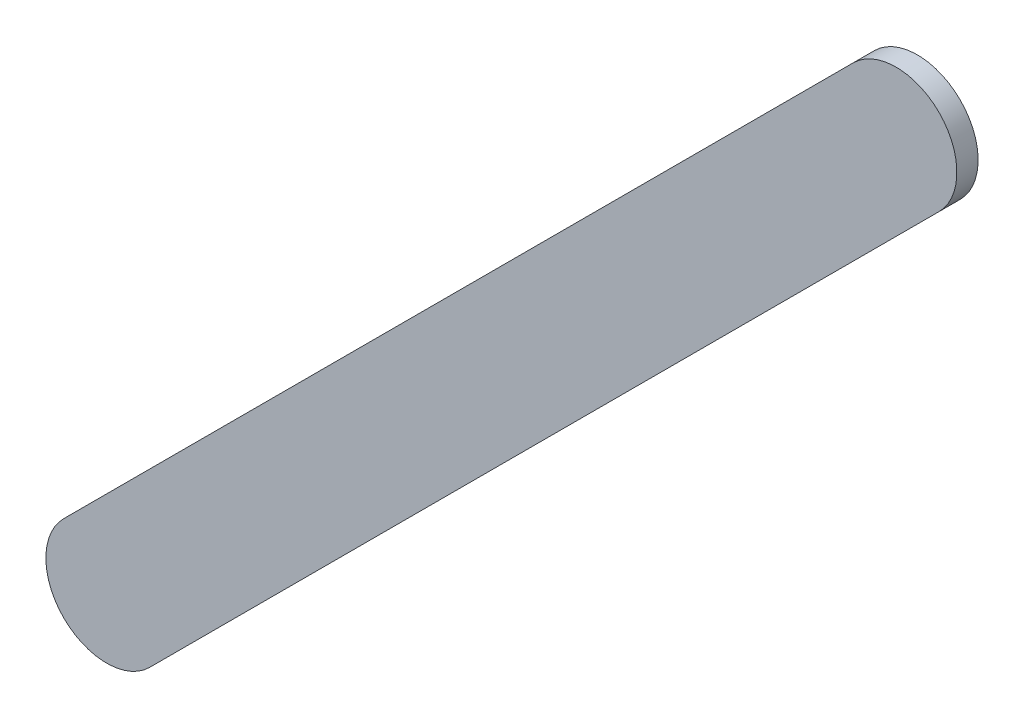
ISO-10303-21;
HEADER;
FILE_DESCRIPTION(('STEP AP214'),'2;1');
FILE_NAME('part.step','',(''),(''),'','','');
FILE_SCHEMA(('AUTOMOTIVE_DESIGN { 1 0 10303 214 1 1 1 1 }'));
ENDSEC;
DATA;
#1=APPLICATION_CONTEXT('core data for automotive mechanical design processes');
#2=APPLICATION_PROTOCOL_DEFINITION('international standard','automotive_design',2000,#1);
#3=PRODUCT_CONTEXT('',#1,'mechanical');
#4=PRODUCT('Part','Part','',(#3));
#5=PRODUCT_RELATED_PRODUCT_CATEGORY('part','',(#4));
#6=PRODUCT_DEFINITION_FORMATION('','',#4);
#7=PRODUCT_DEFINITION_CONTEXT('part definition',#1,'design');
#8=PRODUCT_DEFINITION('design','',#6,#7);
#9=PRODUCT_DEFINITION_SHAPE('','',#8);
#10=(LENGTH_UNIT() NAMED_UNIT(*) SI_UNIT(.MILLI.,.METRE.));
#11=(NAMED_UNIT(*) PLANE_ANGLE_UNIT() SI_UNIT($,.RADIAN.));
#12=(NAMED_UNIT(*) SI_UNIT($,.STERADIAN.) SOLID_ANGLE_UNIT());
#13=UNCERTAINTY_MEASURE_WITH_UNIT(LENGTH_MEASURE(1.E-05),#10,'distance_accuracy_value','');
#14=(GEOMETRIC_REPRESENTATION_CONTEXT(3) GLOBAL_UNCERTAINTY_ASSIGNED_CONTEXT((#13)) GLOBAL_UNIT_ASSIGNED_CONTEXT((#10,
#11,#12)) REPRESENTATION_CONTEXT('',''));
#15=CARTESIAN_POINT('',(0.,0.,0.));
#16=DIRECTION('',(0.,0.,1.));
#17=DIRECTION('',(1.,0.,0.));
#18=AXIS2_PLACEMENT_3D('',#15,#16,#17);
#19=CARTESIAN_POINT('',(82.529289,-117.279289,1.635));
#20=DIRECTION('',(0.,0.,1.));
#21=DIRECTION('',(1.,0.,0.));
#22=AXIS2_PLACEMENT_3D('',#19,#20,#21);
#23=PLANE('',#22);
#24=DIRECTION('',(-0.707106781186548,-0.707106781186548,0.));
#25=VECTOR('',#24,1.);
#26=CARTESIAN_POINT('',(82.529289,-117.279289,1.635));
#27=LINE('',#26,#25);
#28=CARTESIAN_POINT('',(82.529289,-117.279289,1.635));
#29=VERTEX_POINT('',#28);
#30=CARTESIAN_POINT('',(81.229289,-118.579289,1.635));
#31=VERTEX_POINT('',#30);
#32=EDGE_CURVE('E80',#29,#31,#27,.T.);
#33=ORIENTED_EDGE('',*,*,#32,.T.);
#34=CARTESIAN_POINT('',(81.2999995,-118.6499995,1.635));
#35=DIRECTION('',(0.,0.,1.));
#36=DIRECTION('',(-0.707106781186548,0.707106781186548,0.));
#37=AXIS2_PLACEMENT_3D('',#34,#35,#36);
#38=CIRCLE('',#37,0.09999974810218);
#39=CARTESIAN_POINT('',(81.37071,-118.72071,1.635));
#40=VERTEX_POINT('',#39);
#41=EDGE_CURVE('E78',#31,#40,#38,.T.);
#42=ORIENTED_EDGE('',*,*,#41,.T.);
#43=DIRECTION('',(0.707106781186548,0.707106781186548,0.));
#44=VECTOR('',#43,1.);
#45=CARTESIAN_POINT('',(81.37071,-118.72071,1.635));
#46=LINE('',#45,#44);
#47=CARTESIAN_POINT('',(82.67071,-117.42071,1.635));
#48=VERTEX_POINT('',#47);
#49=EDGE_CURVE('E67',#40,#48,#46,.T.);
#50=ORIENTED_EDGE('',*,*,#49,.T.);
#51=CARTESIAN_POINT('',(82.5999995,-117.3499995,1.635));
#52=DIRECTION('',(0.,0.,1.));
#53=DIRECTION('',(0.707106781186548,-0.707106781186548,0.));
#54=AXIS2_PLACEMENT_3D('',#51,#52,#53);
#55=CIRCLE('',#54,0.09999974810218);
#56=EDGE_CURVE('E11',#48,#29,#55,.T.);
#57=ORIENTED_EDGE('',*,*,#56,.T.);
#58=EDGE_LOOP('',(#33,#42,#50,#57));
#59=FACE_BOUND('',#58,.T.);
#60=ADVANCED_FACE('F17',(#59),#23,.T.);
#61=CARTESIAN_POINT('',(82.529289,-117.279289,1.6));
#62=DIRECTION('',(0.,0.,1.));
#63=DIRECTION('',(1.,0.,0.));
#64=AXIS2_PLACEMENT_3D('',#61,#62,#63);
#65=PLANE('',#64);
#66=CARTESIAN_POINT('',(82.5999995,-117.3499995,1.6));
#67=DIRECTION('',(0.,0.,1.));
#68=DIRECTION('',(0.707106781186548,-0.707106781186548,0.));
#69=AXIS2_PLACEMENT_3D('',#66,#67,#68);
#70=CIRCLE('',#69,0.09999974810218);
#71=CARTESIAN_POINT('',(82.67071,-117.42071,1.6));
#72=VERTEX_POINT('',#71);
#73=CARTESIAN_POINT('',(82.529289,-117.279289,1.6));
#74=VERTEX_POINT('',#73);
#75=EDGE_CURVE('E27',#72,#74,#70,.T.);
#76=ORIENTED_EDGE('',*,*,#75,.F.);
#77=DIRECTION('',(0.707106781186548,0.707106781186548,0.));
#78=VECTOR('',#77,1.);
#79=CARTESIAN_POINT('',(81.37071,-118.72071,1.6));
#80=LINE('',#79,#78);
#81=CARTESIAN_POINT('',(81.37071,-118.72071,1.6));
#82=VERTEX_POINT('',#81);
#83=EDGE_CURVE('E85',#82,#72,#80,.T.);
#84=ORIENTED_EDGE('',*,*,#83,.F.);
#85=CARTESIAN_POINT('',(81.2999995,-118.6499995,1.6));
#86=DIRECTION('',(0.,0.,1.));
#87=DIRECTION('',(-0.707106781186548,0.707106781186548,0.));
#88=AXIS2_PLACEMENT_3D('',#85,#86,#87);
#89=CIRCLE('',#88,0.09999974810218);
#90=CARTESIAN_POINT('',(81.229289,-118.579289,1.6));
#91=VERTEX_POINT('',#90);
#92=EDGE_CURVE('E88',#91,#82,#89,.T.);
#93=ORIENTED_EDGE('',*,*,#92,.F.);
#94=DIRECTION('',(-0.707106781186548,-0.707106781186548,0.));
#95=VECTOR('',#94,1.);
#96=CARTESIAN_POINT('',(82.529289,-117.279289,1.6));
#97=LINE('',#96,#95);
#98=EDGE_CURVE('E99',#74,#91,#97,.T.);
#99=ORIENTED_EDGE('',*,*,#98,.F.);
#100=EDGE_LOOP('',(#76,#84,#93,#99));
#101=FACE_BOUND('',#100,.T.);
#102=ADVANCED_FACE('F118',(#101),#65,.F.);
#103=CARTESIAN_POINT('',(82.5999995,-117.3499995,1.6));
#104=DIRECTION('',(0.,0.,-1.));
#105=DIRECTION('',(0.707106781186548,-0.707106781186548,0.));
#106=AXIS2_PLACEMENT_3D('',#103,#104,#105);
#107=CYLINDRICAL_SURFACE('',#106,0.09999974810218);
#108=ORIENTED_EDGE('',*,*,#75,.T.);
#109=DIRECTION('',(0.,0.,1.));
#110=VECTOR('',#109,1.);
#111=CARTESIAN_POINT('',(82.529289,-117.279289,1.6));
#112=LINE('',#111,#110);
#113=EDGE_CURVE('E95',#74,#29,#112,.T.);
#114=ORIENTED_EDGE('',*,*,#113,.T.);
#115=ORIENTED_EDGE('',*,*,#56,.F.);
#116=DIRECTION('',(0.,0.,1.));
#117=VECTOR('',#116,1.);
#118=CARTESIAN_POINT('',(82.67071,-117.42071,1.6));
#119=LINE('',#118,#117);
#120=EDGE_CURVE('E20',#72,#48,#119,.T.);
#121=ORIENTED_EDGE('',*,*,#120,.F.);
#122=EDGE_LOOP('',(#108,#114,#115,#121));
#123=FACE_BOUND('',#122,.T.);
#124=ADVANCED_FACE('F112',(#123),#107,.T.);
#125=CARTESIAN_POINT('',(81.37071,-118.72071,1.6));
#126=DIRECTION('',(-0.707106781186548,0.707106781186548,0.));
#127=DIRECTION('',(0.,0.,1.));
#128=AXIS2_PLACEMENT_3D('',#125,#126,#127);
#129=PLANE('',#128);
#130=ORIENTED_EDGE('',*,*,#83,.T.);
#131=ORIENTED_EDGE('',*,*,#120,.T.);
#132=ORIENTED_EDGE('',*,*,#49,.F.);
#133=DIRECTION('',(0.,0.,1.));
#134=VECTOR('',#133,1.);
#135=CARTESIAN_POINT('',(81.37071,-118.72071,1.6));
#136=LINE('',#135,#134);
#137=EDGE_CURVE('E72',#82,#40,#136,.T.);
#138=ORIENTED_EDGE('',*,*,#137,.F.);
#139=EDGE_LOOP('',(#130,#131,#132,#138));
#140=FACE_BOUND('',#139,.T.);
#141=ADVANCED_FACE('F70',(#140),#129,.F.);
#142=CARTESIAN_POINT('',(81.2999995,-118.6499995,1.6));
#143=DIRECTION('',(0.,0.,-1.));
#144=DIRECTION('',(-0.707106781186548,0.707106781186548,0.));
#145=AXIS2_PLACEMENT_3D('',#142,#143,#144);
#146=CYLINDRICAL_SURFACE('',#145,0.09999974810218);
#147=ORIENTED_EDGE('',*,*,#92,.T.);
#148=ORIENTED_EDGE('',*,*,#137,.T.);
#149=ORIENTED_EDGE('',*,*,#41,.F.);
#150=DIRECTION('',(0.,0.,1.));
#151=VECTOR('',#150,1.);
#152=CARTESIAN_POINT('',(81.229289,-118.579289,1.6));
#153=LINE('',#152,#151);
#154=EDGE_CURVE('E100',#91,#31,#153,.T.);
#155=ORIENTED_EDGE('',*,*,#154,.F.);
#156=EDGE_LOOP('',(#147,#148,#149,#155));
#157=FACE_BOUND('',#156,.T.);
#158=ADVANCED_FACE('F87',(#157),#146,.T.);
#159=CARTESIAN_POINT('',(82.529289,-117.279289,1.6));
#160=DIRECTION('',(0.707106781186548,-0.707106781186548,0.));
#161=DIRECTION('',(0.,0.,-1.));
#162=AXIS2_PLACEMENT_3D('',#159,#160,#161);
#163=PLANE('',#162);
#164=ORIENTED_EDGE('',*,*,#98,.T.);
#165=ORIENTED_EDGE('',*,*,#154,.T.);
#166=ORIENTED_EDGE('',*,*,#32,.F.);
#167=ORIENTED_EDGE('',*,*,#113,.F.);
#168=EDGE_LOOP('',(#164,#165,#166,#167));
#169=FACE_BOUND('',#168,.T.);
#170=ADVANCED_FACE('F117',(#169),#163,.F.);
#171=CLOSED_SHELL('',(#60,#102,#124,#141,#158,#170));
#172=MANIFOLD_SOLID_BREP('B1',#171);
#173=ADVANCED_BREP_SHAPE_REPRESENTATION('',(#18,#172),#14);
#174=SHAPE_DEFINITION_REPRESENTATION(#9,#173);
ENDSEC;
END-ISO-10303-21;
